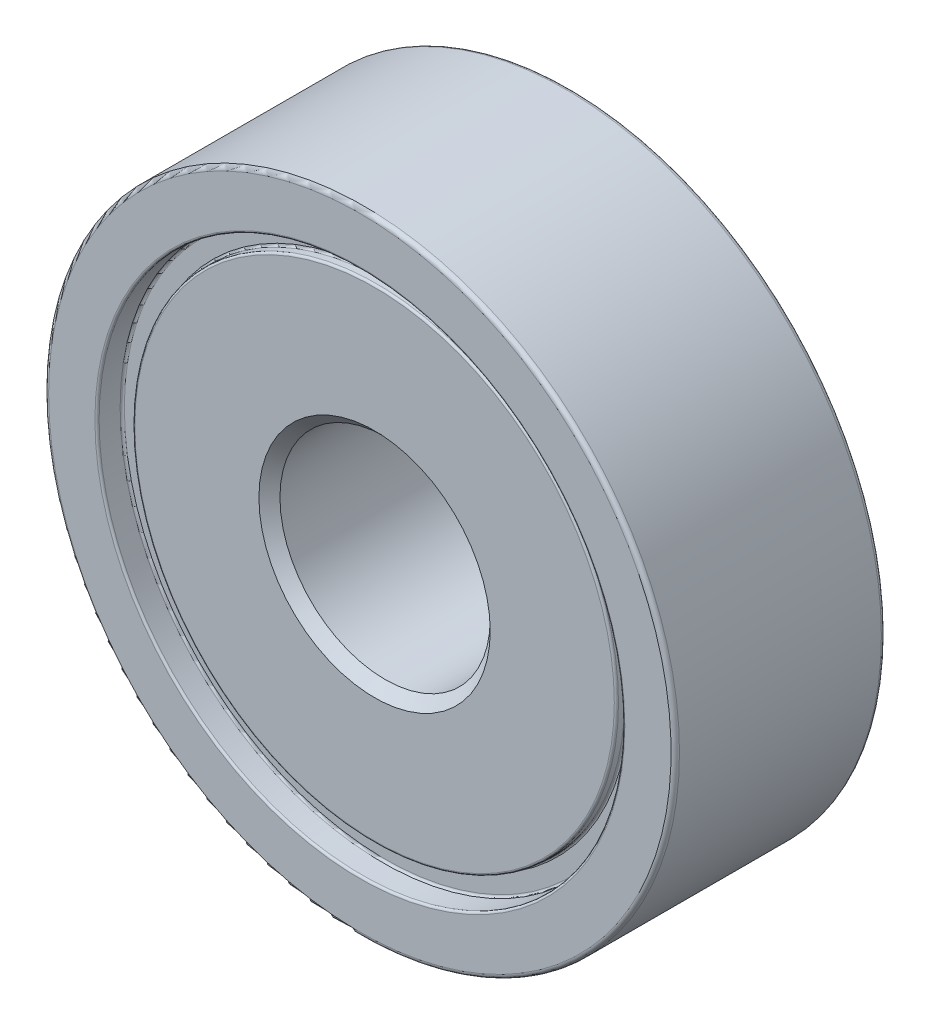
ISO-10303-21;
HEADER;
FILE_DESCRIPTION(('STEP AP214'),'2;1');
FILE_NAME('part.step','',(''),(''),'','','');
FILE_SCHEMA(('AUTOMOTIVE_DESIGN { 1 0 10303 214 1 1 1 1 }'));
ENDSEC;
DATA;
#1=APPLICATION_CONTEXT('core data for automotive mechanical design processes');
#2=APPLICATION_PROTOCOL_DEFINITION('international standard','automotive_design',2000,#1);
#3=PRODUCT_CONTEXT('',#1,'mechanical');
#4=PRODUCT('Part','Part','',(#3));
#5=PRODUCT_RELATED_PRODUCT_CATEGORY('part','',(#4));
#6=PRODUCT_DEFINITION_FORMATION('','',#4);
#7=PRODUCT_DEFINITION_CONTEXT('part definition',#1,'design');
#8=PRODUCT_DEFINITION('design','',#6,#7);
#9=PRODUCT_DEFINITION_SHAPE('','',#8);
#10=(LENGTH_UNIT() NAMED_UNIT(*) SI_UNIT(.MILLI.,.METRE.));
#11=(NAMED_UNIT(*) PLANE_ANGLE_UNIT() SI_UNIT($,.RADIAN.));
#12=(NAMED_UNIT(*) SI_UNIT($,.STERADIAN.) SOLID_ANGLE_UNIT());
#13=UNCERTAINTY_MEASURE_WITH_UNIT(LENGTH_MEASURE(1.E-05),#10,'distance_accuracy_value','');
#14=(GEOMETRIC_REPRESENTATION_CONTEXT(3) GLOBAL_UNCERTAINTY_ASSIGNED_CONTEXT((#13)) GLOBAL_UNIT_ASSIGNED_CONTEXT((#10,
#11,#12)) REPRESENTATION_CONTEXT('',''));
#15=CARTESIAN_POINT('',(0.,0.,0.));
#16=DIRECTION('',(0.,0.,1.));
#17=DIRECTION('',(1.,0.,0.));
#18=AXIS2_PLACEMENT_3D('',#15,#16,#17);
#19=CARTESIAN_POINT('',(0.,0.,145.972624196037));
#20=DIRECTION('',(0.,0.,1.));
#21=DIRECTION('',(1.,0.,0.));
#22=AXIS2_PLACEMENT_3D('',#19,#20,#21);
#23=CYLINDRICAL_SURFACE('',#22,0.50000000000002);
#24=CARTESIAN_POINT('',(0.,0.,-0.879999999999964));
#25=DIRECTION('',(0.,0.,1.));
#26=DIRECTION('',(1.,0.,0.));
#27=AXIS2_PLACEMENT_3D('',#24,#25,#26);
#28=CIRCLE('',#27,0.50000000000002);
#29=CARTESIAN_POINT('',(0.50000000000002,0.,-0.879999999999964));
#30=VERTEX_POINT('',#29);
#31=EDGE_CURVE('E54',#30,#30,#28,.F.);
#32=ORIENTED_EDGE('',*,*,#31,.T.);
#33=EDGE_LOOP('',(#32));
#34=FACE_BOUND('',#33,.T.);
#35=CARTESIAN_POINT('',(0.,0.,-0.119999999999981));
#36=DIRECTION('',(0.,0.,-1.));
#37=DIRECTION('',(-1.,0.,0.));
#38=AXIS2_PLACEMENT_3D('',#35,#36,#37);
#39=CIRCLE('',#38,0.50000000000002);
#40=CARTESIAN_POINT('',(-0.50000000000002,0.,-0.119999999999981));
#41=VERTEX_POINT('',#40);
#42=EDGE_CURVE('E57',#41,#41,#39,.F.);
#43=ORIENTED_EDGE('',*,*,#42,.T.);
#44=EDGE_LOOP('',(#43));
#45=FACE_BOUND('',#44,.T.);
#46=ADVANCED_FACE('F31',(#34,#45),#23,.F.);
#47=CARTESIAN_POINT('',(0.,0.500000000000018,-0.0699999999999966));
#48=DIRECTION('',(0.,0.,-1.));
#49=DIRECTION('',(-1.,0.,0.));
#50=AXIS2_PLACEMENT_3D('',#47,#48,#49);
#51=PLANE('',#50);
#52=CARTESIAN_POINT('',(0.,0.,-0.0699999999999966));
#53=DIRECTION('',(0.,0.,-1.));
#54=DIRECTION('',(-1.,0.,0.));
#55=AXIS2_PLACEMENT_3D('',#52,#53,#54);
#56=CIRCLE('',#55,0.549999999999992);
#57=CARTESIAN_POINT('',(-0.549999999999992,0.,-0.0699999999999966));
#58=VERTEX_POINT('',#57);
#59=EDGE_CURVE('E51',#58,#58,#56,.T.);
#60=ORIENTED_EDGE('',*,*,#59,.T.);
#61=EDGE_LOOP('',(#60));
#62=FACE_BOUND('',#61,.T.);
#63=CARTESIAN_POINT('',(0.,0.,-0.0699999999999966));
#64=DIRECTION('',(0.,0.,-1.));
#65=DIRECTION('',(-1.,0.,0.));
#66=AXIS2_PLACEMENT_3D('',#63,#64,#65);
#67=CIRCLE('',#66,1.14);
#68=CARTESIAN_POINT('',(-1.14,0.,-0.0699999999999966));
#69=VERTEX_POINT('',#68);
#70=EDGE_CURVE('E63',#69,#69,#67,.F.);
#71=ORIENTED_EDGE('',*,*,#70,.T.);
#72=EDGE_LOOP('',(#71));
#73=FACE_BOUND('',#72,.T.);
#74=ADVANCED_FACE('F138',(#62,#73),#51,.F.);
#75=CARTESIAN_POINT('',(0.,0.,145.972624196037));
#76=DIRECTION('',(0.,0.,1.));
#77=DIRECTION('',(1.,0.,0.));
#78=AXIS2_PLACEMENT_3D('',#75,#76,#77);
#79=CYLINDRICAL_SURFACE('',#78,1.15);
#80=CARTESIAN_POINT('',(0.,0.,-0.109999999999999));
#81=DIRECTION('',(0.,0.,-1.));
#82=DIRECTION('',(-1.,0.,0.));
#83=AXIS2_PLACEMENT_3D('',#80,#81,#82);
#84=CIRCLE('',#83,1.15);
#85=CARTESIAN_POINT('',(-1.15,0.,-0.109999999999999));
#86=VERTEX_POINT('',#85);
#87=EDGE_CURVE('E72',#86,#86,#84,.F.);
#88=ORIENTED_EDGE('',*,*,#87,.T.);
#89=EDGE_LOOP('',(#88));
#90=FACE_BOUND('',#89,.T.);
#91=CARTESIAN_POINT('',(0.,0.,-0.0799999999999967));
#92=DIRECTION('',(0.,0.,-1.));
#93=DIRECTION('',(-1.,0.,0.));
#94=AXIS2_PLACEMENT_3D('',#91,#92,#93);
#95=CIRCLE('',#94,1.15);
#96=CARTESIAN_POINT('',(-1.15,0.,-0.0799999999999967));
#97=VERTEX_POINT('',#96);
#98=EDGE_CURVE('E75',#97,#97,#95,.T.);
#99=ORIENTED_EDGE('',*,*,#98,.T.);
#100=EDGE_LOOP('',(#99));
#101=FACE_BOUND('',#100,.T.);
#102=ADVANCED_FACE('F145',(#90,#101),#79,.T.);
#103=CARTESIAN_POINT('',(0.,1.25,-0.12));
#104=DIRECTION('',(0.,0.,-1.));
#105=DIRECTION('',(-1.,0.,0.));
#106=AXIS2_PLACEMENT_3D('',#103,#104,#105);
#107=PLANE('',#106);
#108=CARTESIAN_POINT('',(0.,0.,-0.12));
#109=DIRECTION('',(0.,0.,-1.));
#110=DIRECTION('',(-1.,0.,0.));
#111=AXIS2_PLACEMENT_3D('',#108,#109,#110);
#112=CIRCLE('',#111,1.16);
#113=CARTESIAN_POINT('',(-1.16,0.,-0.12));
#114=VERTEX_POINT('',#113);
#115=EDGE_CURVE('E66',#114,#114,#112,.T.);
#116=ORIENTED_EDGE('',*,*,#115,.T.);
#117=EDGE_LOOP('',(#116));
#118=FACE_BOUND('',#117,.T.);
#119=CARTESIAN_POINT('',(0.,0.,-0.12));
#120=DIRECTION('',(0.,0.,-1.));
#121=DIRECTION('',(-1.,0.,0.));
#122=AXIS2_PLACEMENT_3D('',#119,#120,#121);
#123=CIRCLE('',#122,1.24);
#124=CARTESIAN_POINT('',(-1.24,0.,-0.12));
#125=VERTEX_POINT('',#124);
#126=EDGE_CURVE('E69',#125,#125,#123,.F.);
#127=ORIENTED_EDGE('',*,*,#126,.T.);
#128=EDGE_LOOP('',(#127));
#129=FACE_BOUND('',#128,.T.);
#130=ADVANCED_FACE('F205',(#118,#129),#107,.F.);
#131=CARTESIAN_POINT('',(0.,0.,145.972624196037));
#132=DIRECTION('',(0.,0.,1.));
#133=DIRECTION('',(1.,0.,0.));
#134=AXIS2_PLACEMENT_3D('',#131,#132,#133);
#135=CYLINDRICAL_SURFACE('',#134,1.25);
#136=CARTESIAN_POINT('',(0.,0.,-0.01000000000001));
#137=DIRECTION('',(0.,0.,-1.));
#138=DIRECTION('',(-1.,0.,0.));
#139=AXIS2_PLACEMENT_3D('',#136,#137,#138);
#140=CIRCLE('',#139,1.25);
#141=CARTESIAN_POINT('',(-1.25,0.,-0.01000000000001));
#142=VERTEX_POINT('',#141);
#143=EDGE_CURVE('E81',#142,#142,#140,.F.);
#144=ORIENTED_EDGE('',*,*,#143,.T.);
#145=EDGE_LOOP('',(#144));
#146=FACE_BOUND('',#145,.T.);
#147=CARTESIAN_POINT('',(0.,0.,-0.109999999999999));
#148=DIRECTION('',(0.,0.,-1.));
#149=DIRECTION('',(-1.,0.,0.));
#150=AXIS2_PLACEMENT_3D('',#147,#148,#149);
#151=CIRCLE('',#150,1.25);
#152=CARTESIAN_POINT('',(-1.25,0.,-0.109999999999999));
#153=VERTEX_POINT('',#152);
#154=EDGE_CURVE('E84',#153,#153,#151,.T.);
#155=ORIENTED_EDGE('',*,*,#154,.T.);
#156=EDGE_LOOP('',(#155));
#157=FACE_BOUND('',#156,.T.);
#158=ADVANCED_FACE('F198',(#146,#157),#135,.F.);
#159=CARTESIAN_POINT('',(0.,1.25,0.));
#160=DIRECTION('',(0.,0.,-1.));
#161=DIRECTION('',(-1.,0.,0.));
#162=AXIS2_PLACEMENT_3D('',#159,#160,#161);
#163=PLANE('',#162);
#164=CARTESIAN_POINT('',(0.,0.,0.));
#165=DIRECTION('',(0.,0.,-1.));
#166=DIRECTION('',(-1.,0.,0.));
#167=AXIS2_PLACEMENT_3D('',#164,#165,#166);
#168=CIRCLE('',#167,1.48);
#169=CARTESIAN_POINT('',(-1.48,0.,0.));
#170=VERTEX_POINT('',#169);
#171=EDGE_CURVE('E46',#170,#170,#168,.F.);
#172=ORIENTED_EDGE('',*,*,#171,.T.);
#173=EDGE_LOOP('',(#172));
#174=FACE_BOUND('',#173,.T.);
#175=CARTESIAN_POINT('',(0.,0.,0.));
#176=DIRECTION('',(0.,0.,-1.));
#177=DIRECTION('',(-1.,0.,0.));
#178=AXIS2_PLACEMENT_3D('',#175,#176,#177);
#179=CIRCLE('',#178,1.26);
#180=CARTESIAN_POINT('',(-1.26,0.,0.));
#181=VERTEX_POINT('',#180);
#182=EDGE_CURVE('E78',#181,#181,#179,.T.);
#183=ORIENTED_EDGE('',*,*,#182,.T.);
#184=EDGE_LOOP('',(#183));
#185=FACE_BOUND('',#184,.T.);
#186=ADVANCED_FACE('F195',(#174,#185),#163,.F.);
#187=CARTESIAN_POINT('',(0.,0.,145.972624196037));
#188=DIRECTION('',(0.,0.,1.));
#189=DIRECTION('',(1.,0.,0.));
#190=AXIS2_PLACEMENT_3D('',#187,#188,#189);
#191=CYLINDRICAL_SURFACE('',#190,1.5);
#192=CARTESIAN_POINT('',(0.,0.,-0.0199999999999922));
#193=DIRECTION('',(0.,0.,-1.));
#194=DIRECTION('',(-1.,0.,0.));
#195=AXIS2_PLACEMENT_3D('',#192,#193,#194);
#196=CIRCLE('',#195,1.5);
#197=CARTESIAN_POINT('',(-1.5,0.,-0.0199999999999922));
#198=VERTEX_POINT('',#197);
#199=EDGE_CURVE('E38',#198,#198,#196,.T.);
#200=ORIENTED_EDGE('',*,*,#199,.T.);
#201=EDGE_LOOP('',(#200));
#202=FACE_BOUND('',#201,.T.);
#203=CARTESIAN_POINT('',(0.,0.,-0.980000000000009));
#204=DIRECTION('',(0.,0.,1.));
#205=DIRECTION('',(1.,0.,0.));
#206=AXIS2_PLACEMENT_3D('',#203,#204,#205);
#207=CIRCLE('',#206,1.5);
#208=CARTESIAN_POINT('',(1.5,0.,-0.980000000000009));
#209=VERTEX_POINT('',#208);
#210=EDGE_CURVE('E42',#209,#209,#207,.T.);
#211=ORIENTED_EDGE('',*,*,#210,.T.);
#212=EDGE_LOOP('',(#211));
#213=FACE_BOUND('',#212,.T.);
#214=ADVANCED_FACE('F135',(#202,#213),#191,.T.);
#215=CARTESIAN_POINT('',(0.,1.5,-1.));
#216=DIRECTION('',(0.,0.,1.));
#217=DIRECTION('',(1.,0.,0.));
#218=AXIS2_PLACEMENT_3D('',#215,#216,#217);
#219=PLANE('',#218);
#220=CARTESIAN_POINT('',(0.,0.,-1.));
#221=DIRECTION('',(0.,0.,1.));
#222=DIRECTION('',(1.,0.,0.));
#223=AXIS2_PLACEMENT_3D('',#220,#221,#222);
#224=CIRCLE('',#223,1.48);
#225=CARTESIAN_POINT('',(1.48,0.,-1.));
#226=VERTEX_POINT('',#225);
#227=EDGE_CURVE('E10',#226,#226,#224,.F.);
#228=ORIENTED_EDGE('',*,*,#227,.T.);
#229=EDGE_LOOP('',(#228));
#230=FACE_BOUND('',#229,.T.);
#231=CARTESIAN_POINT('',(0.,0.,-1.));
#232=DIRECTION('',(0.,0.,1.));
#233=DIRECTION('',(1.,0.,0.));
#234=AXIS2_PLACEMENT_3D('',#231,#232,#233);
#235=CIRCLE('',#234,1.26);
#236=CARTESIAN_POINT('',(1.26,0.,-1.));
#237=VERTEX_POINT('',#236);
#238=EDGE_CURVE('E93',#237,#237,#235,.T.);
#239=ORIENTED_EDGE('',*,*,#238,.T.);
#240=EDGE_LOOP('',(#239));
#241=FACE_BOUND('',#240,.T.);
#242=ADVANCED_FACE('F124',(#230,#241),#219,.F.);
#243=CARTESIAN_POINT('',(0.,0.,145.972624196037));
#244=DIRECTION('',(0.,0.,1.));
#245=DIRECTION('',(1.,0.,0.));
#246=AXIS2_PLACEMENT_3D('',#243,#244,#245);
#247=CYLINDRICAL_SURFACE('',#246,1.25);
#248=CARTESIAN_POINT('',(0.,0.,-0.989999999999991));
#249=DIRECTION('',(0.,0.,1.));
#250=DIRECTION('',(1.,0.,0.));
#251=AXIS2_PLACEMENT_3D('',#248,#249,#250);
#252=CIRCLE('',#251,1.25);
#253=CARTESIAN_POINT('',(1.25,0.,-0.989999999999991));
#254=VERTEX_POINT('',#253);
#255=EDGE_CURVE('E87',#254,#254,#252,.F.);
#256=ORIENTED_EDGE('',*,*,#255,.T.);
#257=EDGE_LOOP('',(#256));
#258=FACE_BOUND('',#257,.T.);
#259=CARTESIAN_POINT('',(0.,0.,-0.890000000000002));
#260=DIRECTION('',(0.,0.,1.));
#261=DIRECTION('',(1.,0.,0.));
#262=AXIS2_PLACEMENT_3D('',#259,#260,#261);
#263=CIRCLE('',#262,1.25);
#264=CARTESIAN_POINT('',(1.25,0.,-0.890000000000002));
#265=VERTEX_POINT('',#264);
#266=EDGE_CURVE('E90',#265,#265,#263,.T.);
#267=ORIENTED_EDGE('',*,*,#266,.T.);
#268=EDGE_LOOP('',(#267));
#269=FACE_BOUND('',#268,.T.);
#270=ADVANCED_FACE('F122',(#258,#269),#247,.F.);
#271=CARTESIAN_POINT('',(0.,1.15,-0.88));
#272=DIRECTION('',(0.,0.,1.));
#273=DIRECTION('',(1.,0.,0.));
#274=AXIS2_PLACEMENT_3D('',#271,#272,#273);
#275=PLANE('',#274);
#276=CARTESIAN_POINT('',(0.,0.,-0.88));
#277=DIRECTION('',(0.,0.,1.));
#278=DIRECTION('',(1.,0.,0.));
#279=AXIS2_PLACEMENT_3D('',#276,#277,#278);
#280=CIRCLE('',#279,1.16);
#281=CARTESIAN_POINT('',(1.16,0.,-0.88));
#282=VERTEX_POINT('',#281);
#283=EDGE_CURVE('E105',#282,#282,#280,.T.);
#284=ORIENTED_EDGE('',*,*,#283,.T.);
#285=EDGE_LOOP('',(#284));
#286=FACE_BOUND('',#285,.T.);
#287=CARTESIAN_POINT('',(0.,0.,-0.88));
#288=DIRECTION('',(0.,0.,1.));
#289=DIRECTION('',(1.,0.,0.));
#290=AXIS2_PLACEMENT_3D('',#287,#288,#289);
#291=CIRCLE('',#290,1.24);
#292=CARTESIAN_POINT('',(1.24,0.,-0.88));
#293=VERTEX_POINT('',#292);
#294=EDGE_CURVE('E108',#293,#293,#291,.F.);
#295=ORIENTED_EDGE('',*,*,#294,.T.);
#296=EDGE_LOOP('',(#295));
#297=FACE_BOUND('',#296,.T.);
#298=ADVANCED_FACE('F112',(#286,#297),#275,.F.);
#299=CARTESIAN_POINT('',(0.,0.,145.972624196037));
#300=DIRECTION('',(0.,0.,1.));
#301=DIRECTION('',(1.,0.,0.));
#302=AXIS2_PLACEMENT_3D('',#299,#300,#301);
#303=CYLINDRICAL_SURFACE('',#302,1.15);
#304=CARTESIAN_POINT('',(0.,0.,-0.890000000000002));
#305=DIRECTION('',(0.,0.,1.));
#306=DIRECTION('',(1.,0.,0.));
#307=AXIS2_PLACEMENT_3D('',#304,#305,#306);
#308=CIRCLE('',#307,1.15);
#309=CARTESIAN_POINT('',(1.15,0.,-0.890000000000002));
#310=VERTEX_POINT('',#309);
#311=EDGE_CURVE('E99',#310,#310,#308,.F.);
#312=ORIENTED_EDGE('',*,*,#311,.T.);
#313=EDGE_LOOP('',(#312));
#314=FACE_BOUND('',#313,.T.);
#315=CARTESIAN_POINT('',(0.,0.,-0.920000000000004));
#316=DIRECTION('',(0.,0.,1.));
#317=DIRECTION('',(1.,0.,0.));
#318=AXIS2_PLACEMENT_3D('',#315,#316,#317);
#319=CIRCLE('',#318,1.15);
#320=CARTESIAN_POINT('',(1.15,0.,-0.920000000000004));
#321=VERTEX_POINT('',#320);
#322=EDGE_CURVE('E102',#321,#321,#319,.T.);
#323=ORIENTED_EDGE('',*,*,#322,.T.);
#324=EDGE_LOOP('',(#323));
#325=FACE_BOUND('',#324,.T.);
#326=ADVANCED_FACE('F131',(#314,#325),#303,.T.);
#327=CARTESIAN_POINT('',(0.,1.15,-0.929999999999997));
#328=DIRECTION('',(0.,0.,1.));
#329=DIRECTION('',(1.,0.,0.));
#330=AXIS2_PLACEMENT_3D('',#327,#328,#329);
#331=PLANE('',#330);
#332=CARTESIAN_POINT('',(0.,0.,-0.929999999999997));
#333=DIRECTION('',(0.,0.,1.));
#334=DIRECTION('',(1.,0.,0.));
#335=AXIS2_PLACEMENT_3D('',#332,#333,#334);
#336=CIRCLE('',#335,0.550000000000051);
#337=CARTESIAN_POINT('',(0.550000000000051,0.,-0.929999999999997));
#338=VERTEX_POINT('',#337);
#339=EDGE_CURVE('E60',#338,#338,#336,.T.);
#340=ORIENTED_EDGE('',*,*,#339,.T.);
#341=EDGE_LOOP('',(#340));
#342=FACE_BOUND('',#341,.T.);
#343=CARTESIAN_POINT('',(0.,0.,-0.929999999999997));
#344=DIRECTION('',(0.,0.,1.));
#345=DIRECTION('',(1.,0.,0.));
#346=AXIS2_PLACEMENT_3D('',#343,#344,#345);
#347=CIRCLE('',#346,1.14);
#348=CARTESIAN_POINT('',(1.14,0.,-0.929999999999997));
#349=VERTEX_POINT('',#348);
#350=EDGE_CURVE('E96',#349,#349,#347,.F.);
#351=ORIENTED_EDGE('',*,*,#350,.T.);
#352=EDGE_LOOP('',(#351));
#353=FACE_BOUND('',#352,.T.);
#354=ADVANCED_FACE('F155',(#342,#353),#331,.F.);
#355=CARTESIAN_POINT('',(0.,0.,-0.890000000000002));
#356=DIRECTION('',(0.,0.,1.));
#357=DIRECTION('',(1.,0.,0.));
#358=AXIS2_PLACEMENT_3D('',#355,#356,#357);
#359=TOROIDAL_SURFACE('',#358,1.16,0.01);
#360=ORIENTED_EDGE('',*,*,#311,.F.);
#361=EDGE_LOOP('',(#360));
#362=FACE_BOUND('',#361,.T.);
#363=ORIENTED_EDGE('',*,*,#283,.F.);
#364=EDGE_LOOP('',(#363));
#365=FACE_BOUND('',#364,.T.);
#366=ADVANCED_FACE('F151',(#362,#365),#359,.F.);
#367=CARTESIAN_POINT('',(0.,0.,-0.920000000000004));
#368=DIRECTION('',(0.,0.,1.));
#369=DIRECTION('',(1.,0.,0.));
#370=AXIS2_PLACEMENT_3D('',#367,#368,#369);
#371=TOROIDAL_SURFACE('',#370,1.14,0.01);
#372=ORIENTED_EDGE('',*,*,#350,.F.);
#373=EDGE_LOOP('',(#372));
#374=FACE_BOUND('',#373,.T.);
#375=ORIENTED_EDGE('',*,*,#322,.F.);
#376=EDGE_LOOP('',(#375));
#377=FACE_BOUND('',#376,.T.);
#378=ADVANCED_FACE('F154',(#374,#377),#371,.T.);
#379=CARTESIAN_POINT('',(0.,0.,-0.989999999999991));
#380=DIRECTION('',(0.,0.,1.));
#381=DIRECTION('',(1.,0.,0.));
#382=AXIS2_PLACEMENT_3D('',#379,#380,#381);
#383=TOROIDAL_SURFACE('',#382,1.26,0.01);
#384=ORIENTED_EDGE('',*,*,#255,.F.);
#385=EDGE_LOOP('',(#384));
#386=FACE_BOUND('',#385,.T.);
#387=ORIENTED_EDGE('',*,*,#238,.F.);
#388=EDGE_LOOP('',(#387));
#389=FACE_BOUND('',#388,.T.);
#390=ADVANCED_FACE('F118',(#386,#389),#383,.T.);
#391=CARTESIAN_POINT('',(0.,0.,-0.890000000000002));
#392=DIRECTION('',(0.,0.,1.));
#393=DIRECTION('',(1.,0.,0.));
#394=AXIS2_PLACEMENT_3D('',#391,#392,#393);
#395=TOROIDAL_SURFACE('',#394,1.24,0.01);
#396=ORIENTED_EDGE('',*,*,#294,.F.);
#397=EDGE_LOOP('',(#396));
#398=FACE_BOUND('',#397,.T.);
#399=ORIENTED_EDGE('',*,*,#266,.F.);
#400=EDGE_LOOP('',(#399));
#401=FACE_BOUND('',#400,.T.);
#402=ADVANCED_FACE('F114',(#398,#401),#395,.F.);
#403=CARTESIAN_POINT('',(0.,0.,-0.01000000000001));
#404=DIRECTION('',(0.,0.,-1.));
#405=DIRECTION('',(-1.,0.,0.));
#406=AXIS2_PLACEMENT_3D('',#403,#404,#405);
#407=TOROIDAL_SURFACE('',#406,1.26,0.01);
#408=ORIENTED_EDGE('',*,*,#182,.F.);
#409=EDGE_LOOP('',(#408));
#410=FACE_BOUND('',#409,.T.);
#411=ORIENTED_EDGE('',*,*,#143,.F.);
#412=EDGE_LOOP('',(#411));
#413=FACE_BOUND('',#412,.T.);
#414=ADVANCED_FACE('F117',(#410,#413),#407,.T.);
#415=CARTESIAN_POINT('',(0.,0.,-0.109999999999999));
#416=DIRECTION('',(0.,0.,-1.));
#417=DIRECTION('',(-1.,0.,0.));
#418=AXIS2_PLACEMENT_3D('',#415,#416,#417);
#419=TOROIDAL_SURFACE('',#418,1.16,0.01);
#420=ORIENTED_EDGE('',*,*,#115,.F.);
#421=EDGE_LOOP('',(#420));
#422=FACE_BOUND('',#421,.T.);
#423=ORIENTED_EDGE('',*,*,#87,.F.);
#424=EDGE_LOOP('',(#423));
#425=FACE_BOUND('',#424,.T.);
#426=ADVANCED_FACE('F165',(#422,#425),#419,.F.);
#427=CARTESIAN_POINT('',(0.,0.,-0.109999999999999));
#428=DIRECTION('',(0.,0.,-1.));
#429=DIRECTION('',(-1.,0.,0.));
#430=AXIS2_PLACEMENT_3D('',#427,#428,#429);
#431=TOROIDAL_SURFACE('',#430,1.24,0.01);
#432=ORIENTED_EDGE('',*,*,#154,.F.);
#433=EDGE_LOOP('',(#432));
#434=FACE_BOUND('',#433,.T.);
#435=ORIENTED_EDGE('',*,*,#126,.F.);
#436=EDGE_LOOP('',(#435));
#437=FACE_BOUND('',#436,.T.);
#438=ADVANCED_FACE('F169',(#434,#437),#431,.F.);
#439=CARTESIAN_POINT('',(0.,0.,-0.0799999999999967));
#440=DIRECTION('',(0.,0.,-1.));
#441=DIRECTION('',(-1.,0.,0.));
#442=AXIS2_PLACEMENT_3D('',#439,#440,#441);
#443=TOROIDAL_SURFACE('',#442,1.14,0.01);
#444=ORIENTED_EDGE('',*,*,#98,.F.);
#445=EDGE_LOOP('',(#444));
#446=FACE_BOUND('',#445,.T.);
#447=ORIENTED_EDGE('',*,*,#70,.F.);
#448=EDGE_LOOP('',(#447));
#449=FACE_BOUND('',#448,.T.);
#450=ADVANCED_FACE('F173',(#446,#449),#443,.T.);
#451=CARTESIAN_POINT('',(0.,0.,-0.929999999999986));
#452=DIRECTION('',(0.,0.,-1.));
#453=DIRECTION('',(-1.,0.,0.));
#454=AXIS2_PLACEMENT_3D('',#451,#452,#453);
#455=CONICAL_SURFACE('',#454,0.550000000000041,0.78539816339744);
#456=ORIENTED_EDGE('',*,*,#31,.F.);
#457=EDGE_LOOP('',(#456));
#458=FACE_BOUND('',#457,.T.);
#459=ORIENTED_EDGE('',*,*,#339,.F.);
#460=EDGE_LOOP('',(#459));
#461=FACE_BOUND('',#460,.T.);
#462=ADVANCED_FACE('F177',(#458,#461),#455,.F.);
#463=CARTESIAN_POINT('',(0.,0.,-0.119999999999981));
#464=DIRECTION('',(0.,0.,1.));
#465=DIRECTION('',(1.,0.,0.));
#466=AXIS2_PLACEMENT_3D('',#463,#464,#465);
#467=CONICAL_SURFACE('',#466,0.50000000000002,0.785398163397327);
#468=ORIENTED_EDGE('',*,*,#59,.F.);
#469=EDGE_LOOP('',(#468));
#470=FACE_BOUND('',#469,.T.);
#471=ORIENTED_EDGE('',*,*,#42,.F.);
#472=EDGE_LOOP('',(#471));
#473=FACE_BOUND('',#472,.T.);
#474=ADVANCED_FACE('F181',(#470,#473),#467,.F.);
#475=CARTESIAN_POINT('',(0.,0.,-0.0199999999999922));
#476=DIRECTION('',(0.,0.,-1.));
#477=DIRECTION('',(-1.,0.,0.));
#478=AXIS2_PLACEMENT_3D('',#475,#476,#477);
#479=TOROIDAL_SURFACE('',#478,1.48,0.02);
#480=ORIENTED_EDGE('',*,*,#199,.F.);
#481=EDGE_LOOP('',(#480));
#482=FACE_BOUND('',#481,.T.);
#483=ORIENTED_EDGE('',*,*,#171,.F.);
#484=EDGE_LOOP('',(#483));
#485=FACE_BOUND('',#484,.T.);
#486=ADVANCED_FACE('F184',(#482,#485),#479,.T.);
#487=CARTESIAN_POINT('',(0.,0.,-0.980000000000009));
#488=DIRECTION('',(0.,0.,1.));
#489=DIRECTION('',(1.,0.,0.));
#490=AXIS2_PLACEMENT_3D('',#487,#488,#489);
#491=TOROIDAL_SURFACE('',#490,1.48,0.02);
#492=ORIENTED_EDGE('',*,*,#227,.F.);
#493=EDGE_LOOP('',(#492));
#494=FACE_BOUND('',#493,.T.);
#495=ORIENTED_EDGE('',*,*,#210,.F.);
#496=EDGE_LOOP('',(#495));
#497=FACE_BOUND('',#496,.T.);
#498=ADVANCED_FACE('F33',(#494,#497),#491,.T.);
#499=CLOSED_SHELL('',(#46,#74,#102,#130,#158,#186,#214,#242,#270,#298,#326,#354,#366,#378,#390,
#402,#414,#426,#438,#450,#462,#474,#486,#498));
#500=MANIFOLD_SOLID_BREP('B2',#499);
#501=ADVANCED_BREP_SHAPE_REPRESENTATION('',(#18,#500),#14);
#502=SHAPE_DEFINITION_REPRESENTATION(#9,#501);
ENDSEC;
END-ISO-10303-21;
